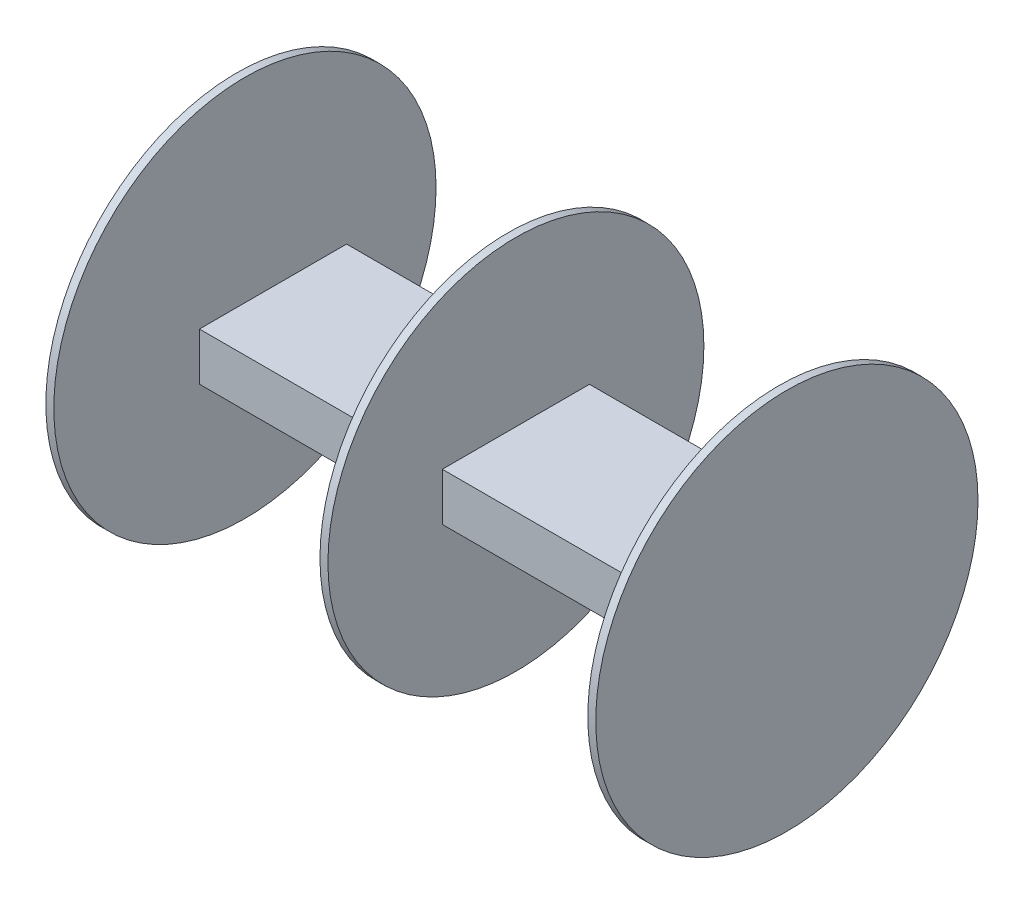
ISO-10303-21;
HEADER;
FILE_DESCRIPTION(('STEP AP214'),'2;1');
FILE_NAME('part.step','',(''),(''),'','','');
FILE_SCHEMA(('AUTOMOTIVE_DESIGN { 1 0 10303 214 1 1 1 1 }'));
ENDSEC;
DATA;
#1=APPLICATION_CONTEXT('core data for automotive mechanical design processes');
#2=APPLICATION_PROTOCOL_DEFINITION('international standard','automotive_design',2000,#1);
#3=PRODUCT_CONTEXT('',#1,'mechanical');
#4=PRODUCT('Part','Part','',(#3));
#5=PRODUCT_RELATED_PRODUCT_CATEGORY('part','',(#4));
#6=PRODUCT_DEFINITION_FORMATION('','',#4);
#7=PRODUCT_DEFINITION_CONTEXT('part definition',#1,'design');
#8=PRODUCT_DEFINITION('design','',#6,#7);
#9=PRODUCT_DEFINITION_SHAPE('','',#8);
#10=(LENGTH_UNIT() NAMED_UNIT(*) SI_UNIT(.MILLI.,.METRE.));
#11=(NAMED_UNIT(*) PLANE_ANGLE_UNIT() SI_UNIT($,.RADIAN.));
#12=(NAMED_UNIT(*) SI_UNIT($,.STERADIAN.) SOLID_ANGLE_UNIT());
#13=UNCERTAINTY_MEASURE_WITH_UNIT(LENGTH_MEASURE(1.E-05),#10,'distance_accuracy_value','');
#14=(GEOMETRIC_REPRESENTATION_CONTEXT(3) GLOBAL_UNCERTAINTY_ASSIGNED_CONTEXT((#13)) GLOBAL_UNIT_ASSIGNED_CONTEXT((#10,
#11,#12)) REPRESENTATION_CONTEXT('',''));
#15=CARTESIAN_POINT('',(0.,0.,0.));
#16=DIRECTION('',(0.,0.,1.));
#17=DIRECTION('',(1.,0.,0.));
#18=AXIS2_PLACEMENT_3D('',#15,#16,#17);
#19=CARTESIAN_POINT('',(-864.293761183555,0.,0.));
#20=DIRECTION('',(1.,0.,0.));
#21=DIRECTION('',(0.,0.,1.));
#22=AXIS2_PLACEMENT_3D('',#19,#20,#21);
#23=CYLINDRICAL_SURFACE('',#22,304.8);
#24=CARTESIAN_POINT('',(-864.293761183555,0.,0.));
#25=DIRECTION('',(1.,0.,0.));
#26=DIRECTION('',(0.,0.,-1.));
#27=AXIS2_PLACEMENT_3D('',#24,#25,#26);
#28=CIRCLE('',#27,304.8);
#29=CARTESIAN_POINT('',(-864.293761183555,0.,-304.8));
#30=VERTEX_POINT('',#29);
#31=EDGE_CURVE('E11',#30,#30,#28,.T.);
#32=ORIENTED_EDGE('',*,*,#31,.T.);
#33=EDGE_LOOP('',(#32));
#34=FACE_BOUND('',#33,.T.);
#35=CARTESIAN_POINT('',(-851.593761183555,0.,0.));
#36=DIRECTION('',(1.,0.,0.));
#37=DIRECTION('',(0.,0.,-1.));
#38=AXIS2_PLACEMENT_3D('',#35,#36,#37);
#39=CIRCLE('',#38,304.8);
#40=CARTESIAN_POINT('',(-851.593761183555,0.,-304.8));
#41=VERTEX_POINT('',#40);
#42=EDGE_CURVE('E51',#41,#41,#39,.T.);
#43=ORIENTED_EDGE('',*,*,#42,.F.);
#44=EDGE_LOOP('',(#43));
#45=FACE_BOUND('',#44,.T.);
#46=ADVANCED_FACE('F48',(#34,#45),#23,.T.);
#47=CARTESIAN_POINT('',(-864.293761183555,0.,0.));
#48=DIRECTION('',(-1.,0.,0.));
#49=DIRECTION('',(0.,0.,-1.));
#50=AXIS2_PLACEMENT_3D('',#47,#48,#49);
#51=PLANE('',#50);
#52=ORIENTED_EDGE('',*,*,#31,.F.);
#53=EDGE_LOOP('',(#52));
#54=FACE_BOUND('',#53,.T.);
#55=ADVANCED_FACE('F63',(#54),#51,.T.);
#56=CARTESIAN_POINT('',(-851.593761183555,0.,0.));
#57=DIRECTION('',(-1.,0.,0.));
#58=DIRECTION('',(0.,0.,-1.));
#59=AXIS2_PLACEMENT_3D('',#56,#57,#58);
#60=PLANE('',#59);
#61=ORIENTED_EDGE('',*,*,#42,.T.);
#62=EDGE_LOOP('',(#61));
#63=FACE_BOUND('',#62,.T.);
#64=ADVANCED_FACE('F60',(#63),#60,.F.);
#65=CLOSED_SHELL('',(#46,#55,#64));
#66=MANIFOLD_SOLID_BREP('B2',#65);
#67=CARTESIAN_POINT('',(-432.146880591778,0.,0.));
#68=DIRECTION('',(1.,0.,0.));
#69=DIRECTION('',(0.,0.,-1.));
#70=AXIS2_PLACEMENT_3D('',#67,#68,#69);
#71=CYLINDRICAL_SURFACE('',#70,299.8);
#72=CARTESIAN_POINT('',(-432.146880591778,0.,0.));
#73=DIRECTION('',(-1.,0.,0.));
#74=DIRECTION('',(0.,0.,1.));
#75=AXIS2_PLACEMENT_3D('',#72,#73,#74);
#76=CIRCLE('',#75,299.8);
#77=CARTESIAN_POINT('',(-432.146880591778,0.,299.8));
#78=VERTEX_POINT('',#77);
#79=EDGE_CURVE('E47',#78,#78,#76,.T.);
#80=ORIENTED_EDGE('',*,*,#79,.F.);
#81=EDGE_LOOP('',(#80));
#82=FACE_BOUND('',#81,.T.);
#83=CARTESIAN_POINT('',(-419.446880591778,0.,0.));
#84=DIRECTION('',(-1.,0.,0.));
#85=DIRECTION('',(0.,0.,1.));
#86=AXIS2_PLACEMENT_3D('',#83,#84,#85);
#87=CIRCLE('',#86,299.8);
#88=CARTESIAN_POINT('',(-419.446880591778,0.,299.8));
#89=VERTEX_POINT('',#88);
#90=EDGE_CURVE('E102',#89,#89,#87,.T.);
#91=ORIENTED_EDGE('',*,*,#90,.T.);
#92=EDGE_LOOP('',(#91));
#93=FACE_BOUND('',#92,.T.);
#94=ADVANCED_FACE('F99',(#82,#93),#71,.T.);
#95=CARTESIAN_POINT('',(-432.146880591778,0.,0.));
#96=DIRECTION('',(-1.,0.,0.));
#97=DIRECTION('',(0.,0.,1.));
#98=AXIS2_PLACEMENT_3D('',#95,#96,#97);
#99=PLANE('',#98);
#100=ORIENTED_EDGE('',*,*,#79,.T.);
#101=EDGE_LOOP('',(#100));
#102=FACE_BOUND('',#101,.T.);
#103=ADVANCED_FACE('F114',(#102),#99,.T.);
#104=CARTESIAN_POINT('',(-419.446880591778,0.,0.));
#105=DIRECTION('',(-1.,0.,0.));
#106=DIRECTION('',(0.,0.,1.));
#107=AXIS2_PLACEMENT_3D('',#104,#105,#106);
#108=PLANE('',#107);
#109=ORIENTED_EDGE('',*,*,#90,.F.);
#110=EDGE_LOOP('',(#109));
#111=FACE_BOUND('',#110,.T.);
#112=ADVANCED_FACE('F112',(#111),#108,.F.);
#113=CLOSED_SHELL('',(#94,#103,#112));
#114=MANIFOLD_SOLID_BREP('B6',#113);
#115=CARTESIAN_POINT('',(-806.796880591778,38.1,-117.333159185914));
#116=DIRECTION('',(1.,0.,0.));
#117=DIRECTION('',(0.,0.,-1.));
#118=AXIS2_PLACEMENT_3D('',#115,#116,#117);
#119=PLANE('',#118);
#120=DIRECTION('',(0.,0.,1.));
#121=VECTOR('',#120,1.);
#122=CARTESIAN_POINT('',(-806.796880591778,-38.1,-117.333159185914));
#123=LINE('',#122,#121);
#124=CARTESIAN_POINT('',(-806.796880591778,-38.1,-117.333159185914));
#125=VERTEX_POINT('',#124);
#126=CARTESIAN_POINT('',(-806.796880591778,-38.1,117.333159185914));
#127=VERTEX_POINT('',#126);
#128=EDGE_CURVE('E210',#125,#127,#123,.T.);
#129=ORIENTED_EDGE('',*,*,#128,.T.);
#130=DIRECTION('',(0.,-1.,0.));
#131=VECTOR('',#130,1.);
#132=CARTESIAN_POINT('',(-806.796880591778,38.1,117.333159185914));
#133=LINE('',#132,#131);
#134=CARTESIAN_POINT('',(-806.796880591778,38.1,117.333159185914));
#135=VERTEX_POINT('',#134);
#136=EDGE_CURVE('E97',#135,#127,#133,.T.);
#137=ORIENTED_EDGE('',*,*,#136,.F.);
#138=DIRECTION('',(0.,0.,1.));
#139=VECTOR('',#138,1.);
#140=CARTESIAN_POINT('',(-806.796880591778,38.1,-117.333159185914));
#141=LINE('',#140,#139);
#142=CARTESIAN_POINT('',(-806.796880591778,38.1,-117.333159185914));
#143=VERTEX_POINT('',#142);
#144=EDGE_CURVE('E198',#143,#135,#141,.T.);
#145=ORIENTED_EDGE('',*,*,#144,.F.);
#146=DIRECTION('',(0.,-1.,0.));
#147=VECTOR('',#146,1.);
#148=CARTESIAN_POINT('',(-806.796880591778,38.1,-117.333159185914));
#149=LINE('',#148,#147);
#150=EDGE_CURVE('E206',#143,#125,#149,.T.);
#151=ORIENTED_EDGE('',*,*,#150,.T.);
#152=EDGE_LOOP('',(#129,#137,#145,#151));
#153=FACE_BOUND('',#152,.T.);
#154=ADVANCED_FACE('F147',(#153),#119,.F.);
#155=CARTESIAN_POINT('',(-806.796880591778,38.1,117.333159185914));
#156=DIRECTION('',(0.,0.,-1.));
#157=DIRECTION('',(-1.,0.,0.));
#158=AXIS2_PLACEMENT_3D('',#155,#156,#157);
#159=PLANE('',#158);
#160=DIRECTION('',(1.,0.,0.));
#161=VECTOR('',#160,1.);
#162=CARTESIAN_POINT('',(-806.796880591778,-38.1,117.333159185914));
#163=LINE('',#162,#161);
#164=CARTESIAN_POINT('',(-44.7968805917775,-38.1,117.333159185914));
#165=VERTEX_POINT('',#164);
#166=EDGE_CURVE('E202',#127,#165,#163,.T.);
#167=ORIENTED_EDGE('',*,*,#166,.T.);
#168=DIRECTION('',(0.,-1.,0.));
#169=VECTOR('',#168,1.);
#170=CARTESIAN_POINT('',(-44.7968805917775,38.1,117.333159185914));
#171=LINE('',#170,#169);
#172=CARTESIAN_POINT('',(-44.7968805917775,38.1,117.333159185914));
#173=VERTEX_POINT('',#172);
#174=EDGE_CURVE('E155',#173,#165,#171,.T.);
#175=ORIENTED_EDGE('',*,*,#174,.F.);
#176=DIRECTION('',(1.,0.,0.));
#177=VECTOR('',#176,1.);
#178=CARTESIAN_POINT('',(-806.796880591778,38.1,117.333159185914));
#179=LINE('',#178,#177);
#180=EDGE_CURVE('E193',#135,#173,#179,.T.);
#181=ORIENTED_EDGE('',*,*,#180,.F.);
#182=ORIENTED_EDGE('',*,*,#136,.T.);
#183=EDGE_LOOP('',(#167,#175,#181,#182));
#184=FACE_BOUND('',#183,.T.);
#185=ADVANCED_FACE('F201',(#184),#159,.F.);
#186=CARTESIAN_POINT('',(-44.7968805917775,38.1,-117.333159185914));
#187=DIRECTION('',(-1.,0.,0.));
#188=DIRECTION('',(0.,0.,1.));
#189=AXIS2_PLACEMENT_3D('',#186,#187,#188);
#190=PLANE('',#189);
#191=DIRECTION('',(0.,0.,-1.));
#192=VECTOR('',#191,1.);
#193=CARTESIAN_POINT('',(-44.7968805917775,-38.1,-117.333159185914));
#194=LINE('',#193,#192);
#195=CARTESIAN_POINT('',(-44.7968805917775,-38.1,-117.333159185914));
#196=VERTEX_POINT('',#195);
#197=EDGE_CURVE('E180',#165,#196,#194,.T.);
#198=ORIENTED_EDGE('',*,*,#197,.T.);
#199=DIRECTION('',(0.,-1.,0.));
#200=VECTOR('',#199,1.);
#201=CARTESIAN_POINT('',(-44.7968805917775,38.1,-117.333159185914));
#202=LINE('',#201,#200);
#203=CARTESIAN_POINT('',(-44.7968805917775,38.1,-117.333159185914));
#204=VERTEX_POINT('',#203);
#205=EDGE_CURVE('E203',#204,#196,#202,.T.);
#206=ORIENTED_EDGE('',*,*,#205,.F.);
#207=DIRECTION('',(0.,0.,-1.));
#208=VECTOR('',#207,1.);
#209=CARTESIAN_POINT('',(-44.7968805917775,38.1,-117.333159185914));
#210=LINE('',#209,#208);
#211=EDGE_CURVE('E196',#173,#204,#210,.T.);
#212=ORIENTED_EDGE('',*,*,#211,.F.);
#213=ORIENTED_EDGE('',*,*,#174,.T.);
#214=EDGE_LOOP('',(#198,#206,#212,#213));
#215=FACE_BOUND('',#214,.T.);
#216=ADVANCED_FACE('F204',(#215),#190,.F.);
#217=CARTESIAN_POINT('',(-806.796880591778,38.1,-117.333159185914));
#218=DIRECTION('',(0.,0.,1.));
#219=DIRECTION('',(1.,0.,0.));
#220=AXIS2_PLACEMENT_3D('',#217,#218,#219);
#221=PLANE('',#220);
#222=DIRECTION('',(-1.,0.,0.));
#223=VECTOR('',#222,1.);
#224=CARTESIAN_POINT('',(-806.796880591778,-38.1,-117.333159185914));
#225=LINE('',#224,#223);
#226=EDGE_CURVE('E186',#196,#125,#225,.T.);
#227=ORIENTED_EDGE('',*,*,#226,.T.);
#228=ORIENTED_EDGE('',*,*,#150,.F.);
#229=DIRECTION('',(-1.,0.,0.));
#230=VECTOR('',#229,1.);
#231=CARTESIAN_POINT('',(-806.796880591778,38.1,-117.333159185914));
#232=LINE('',#231,#230);
#233=EDGE_CURVE('E163',#204,#143,#232,.T.);
#234=ORIENTED_EDGE('',*,*,#233,.F.);
#235=ORIENTED_EDGE('',*,*,#205,.T.);
#236=EDGE_LOOP('',(#227,#228,#234,#235));
#237=FACE_BOUND('',#236,.T.);
#238=ADVANCED_FACE('F217',(#237),#221,.F.);
#239=CARTESIAN_POINT('',(0.,38.1,0.));
#240=DIRECTION('',(0.,1.,0.));
#241=DIRECTION('',(0.,0.,1.));
#242=AXIS2_PLACEMENT_3D('',#239,#240,#241);
#243=PLANE('',#242);
#244=ORIENTED_EDGE('',*,*,#144,.T.);
#245=ORIENTED_EDGE('',*,*,#180,.T.);
#246=ORIENTED_EDGE('',*,*,#211,.T.);
#247=ORIENTED_EDGE('',*,*,#233,.T.);
#248=EDGE_LOOP('',(#244,#245,#246,#247));
#249=FACE_BOUND('',#248,.T.);
#250=ADVANCED_FACE('F194',(#249),#243,.T.);
#251=CARTESIAN_POINT('',(0.,-38.1,0.));
#252=DIRECTION('',(0.,1.,0.));
#253=DIRECTION('',(0.,0.,1.));
#254=AXIS2_PLACEMENT_3D('',#251,#252,#253);
#255=PLANE('',#254);
#256=ORIENTED_EDGE('',*,*,#128,.F.);
#257=ORIENTED_EDGE('',*,*,#226,.F.);
#258=ORIENTED_EDGE('',*,*,#197,.F.);
#259=ORIENTED_EDGE('',*,*,#166,.F.);
#260=EDGE_LOOP('',(#256,#257,#258,#259));
#261=FACE_BOUND('',#260,.T.);
#262=ADVANCED_FACE('F220',(#261),#255,.F.);
#263=CLOSED_SHELL('',(#154,#185,#216,#238,#250,#262));
#264=MANIFOLD_SOLID_BREP('B42',#263);
#265=CARTESIAN_POINT('',(12.7,0.,0.));
#266=DIRECTION('',(-1.,0.,0.));
#267=DIRECTION('',(0.,0.,1.));
#268=AXIS2_PLACEMENT_3D('',#265,#266,#267);
#269=CYLINDRICAL_SURFACE('',#268,304.8);
#270=CARTESIAN_POINT('',(12.7,0.,0.));
#271=DIRECTION('',(1.,0.,0.));
#272=DIRECTION('',(0.,0.,-1.));
#273=AXIS2_PLACEMENT_3D('',#270,#271,#272);
#274=CIRCLE('',#273,304.8);
#275=CARTESIAN_POINT('',(12.7,0.,-304.8));
#276=VERTEX_POINT('',#275);
#277=EDGE_CURVE('E146',#276,#276,#274,.T.);
#278=ORIENTED_EDGE('',*,*,#277,.F.);
#279=EDGE_LOOP('',(#278));
#280=FACE_BOUND('',#279,.T.);
#281=CARTESIAN_POINT('',(0.,0.,0.));
#282=DIRECTION('',(1.,0.,0.));
#283=DIRECTION('',(0.,0.,-1.));
#284=AXIS2_PLACEMENT_3D('',#281,#282,#283);
#285=CIRCLE('',#284,304.8);
#286=CARTESIAN_POINT('',(0.,0.,-304.8));
#287=VERTEX_POINT('',#286);
#288=EDGE_CURVE('E274',#287,#287,#285,.T.);
#289=ORIENTED_EDGE('',*,*,#288,.T.);
#290=EDGE_LOOP('',(#289));
#291=FACE_BOUND('',#290,.T.);
#292=ADVANCED_FACE('F271',(#280,#291),#269,.T.);
#293=CARTESIAN_POINT('',(12.7,0.,0.));
#294=DIRECTION('',(1.,0.,0.));
#295=DIRECTION('',(0.,0.,-1.));
#296=AXIS2_PLACEMENT_3D('',#293,#294,#295);
#297=PLANE('',#296);
#298=ORIENTED_EDGE('',*,*,#277,.T.);
#299=EDGE_LOOP('',(#298));
#300=FACE_BOUND('',#299,.T.);
#301=ADVANCED_FACE('F286',(#300),#297,.T.);
#302=CARTESIAN_POINT('',(0.,0.,0.));
#303=DIRECTION('',(1.,0.,0.));
#304=DIRECTION('',(0.,0.,-1.));
#305=AXIS2_PLACEMENT_3D('',#302,#303,#304);
#306=PLANE('',#305);
#307=ORIENTED_EDGE('',*,*,#288,.F.);
#308=EDGE_LOOP('',(#307));
#309=FACE_BOUND('',#308,.T.);
#310=ADVANCED_FACE('F284',(#309),#306,.F.);
#311=CLOSED_SHELL('',(#292,#301,#310));
#312=MANIFOLD_SOLID_BREP('B91',#311);
#313=ADVANCED_BREP_SHAPE_REPRESENTATION('',(#18,#66,#114,#264,#312),#14);
#314=SHAPE_DEFINITION_REPRESENTATION(#9,#313);
ENDSEC;
END-ISO-10303-21;
